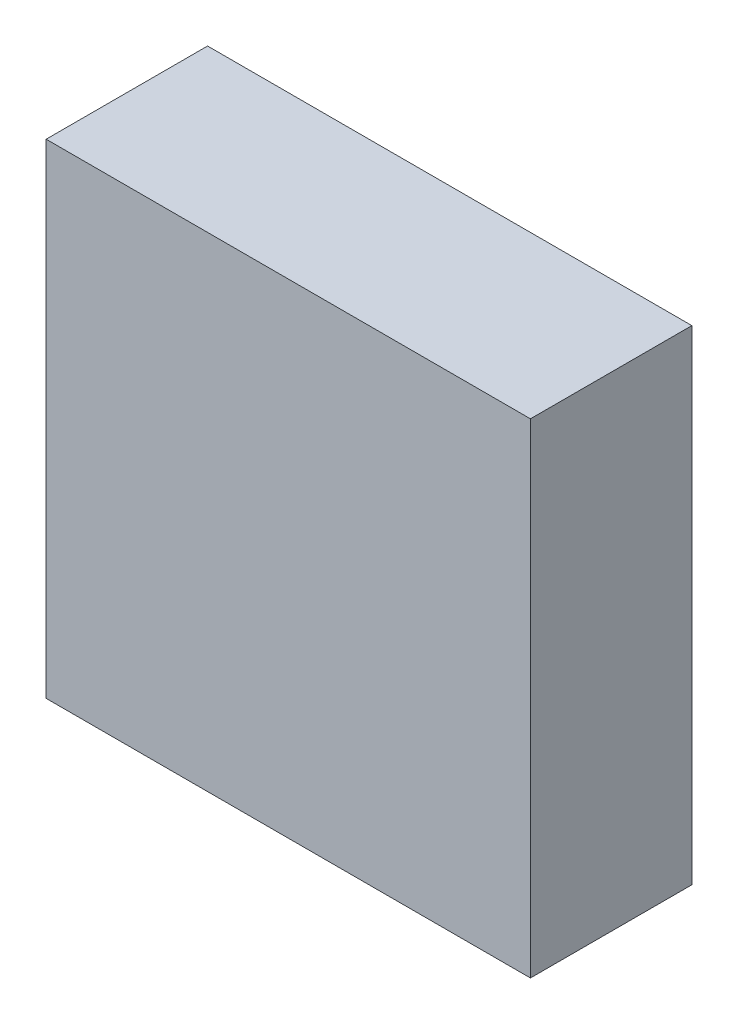
ISO-10303-21;
HEADER;
FILE_DESCRIPTION(('STEP AP214'),'2;1');
FILE_NAME('part.step','',(''),(''),'','','');
FILE_SCHEMA(('AUTOMOTIVE_DESIGN { 1 0 10303 214 1 1 1 1 }'));
ENDSEC;
DATA;
#1=APPLICATION_CONTEXT('core data for automotive mechanical design processes');
#2=APPLICATION_PROTOCOL_DEFINITION('international standard','automotive_design',2000,#1);
#3=PRODUCT_CONTEXT('',#1,'mechanical');
#4=PRODUCT('Part','Part','',(#3));
#5=PRODUCT_RELATED_PRODUCT_CATEGORY('part','',(#4));
#6=PRODUCT_DEFINITION_FORMATION('','',#4);
#7=PRODUCT_DEFINITION_CONTEXT('part definition',#1,'design');
#8=PRODUCT_DEFINITION('design','',#6,#7);
#9=PRODUCT_DEFINITION_SHAPE('','',#8);
#10=(LENGTH_UNIT() NAMED_UNIT(*) SI_UNIT(.MILLI.,.METRE.));
#11=(NAMED_UNIT(*) PLANE_ANGLE_UNIT() SI_UNIT($,.RADIAN.));
#12=(NAMED_UNIT(*) SI_UNIT($,.STERADIAN.) SOLID_ANGLE_UNIT());
#13=UNCERTAINTY_MEASURE_WITH_UNIT(LENGTH_MEASURE(1.E-05),#10,'distance_accuracy_value','');
#14=(GEOMETRIC_REPRESENTATION_CONTEXT(3) GLOBAL_UNCERTAINTY_ASSIGNED_CONTEXT((#13)) GLOBAL_UNIT_ASSIGNED_CONTEXT((#10,
#11,#12)) REPRESENTATION_CONTEXT('',''));
#15=CARTESIAN_POINT('',(0.,0.,0.));
#16=DIRECTION('',(0.,0.,1.));
#17=DIRECTION('',(1.,0.,0.));
#18=AXIS2_PLACEMENT_3D('',#15,#16,#17);
#19=CARTESIAN_POINT('',(15.,-15.,10.));
#20=DIRECTION('',(-1.,0.,0.));
#21=DIRECTION('',(0.,0.,1.));
#22=AXIS2_PLACEMENT_3D('',#19,#20,#21);
#23=PLANE('',#22);
#24=DIRECTION('',(0.,1.,0.));
#25=VECTOR('',#24,1.);
#26=CARTESIAN_POINT('',(15.,-15.,0.));
#27=LINE('',#26,#25);
#28=CARTESIAN_POINT('',(15.,-15.,0.));
#29=VERTEX_POINT('',#28);
#30=CARTESIAN_POINT('',(15.,15.,0.));
#31=VERTEX_POINT('',#30);
#32=EDGE_CURVE('E96',#29,#31,#27,.T.);
#33=ORIENTED_EDGE('',*,*,#32,.T.);
#34=DIRECTION('',(0.,0.,-1.));
#35=VECTOR('',#34,1.);
#36=CARTESIAN_POINT('',(15.,15.,10.));
#37=LINE('',#36,#35);
#38=CARTESIAN_POINT('',(15.,15.,10.));
#39=VERTEX_POINT('',#38);
#40=EDGE_CURVE('E11',#39,#31,#37,.T.);
#41=ORIENTED_EDGE('',*,*,#40,.F.);
#42=DIRECTION('',(0.,1.,0.));
#43=VECTOR('',#42,1.);
#44=CARTESIAN_POINT('',(15.,-15.,10.));
#45=LINE('',#44,#43);
#46=CARTESIAN_POINT('',(15.,-15.,10.));
#47=VERTEX_POINT('',#46);
#48=EDGE_CURVE('E84',#47,#39,#45,.T.);
#49=ORIENTED_EDGE('',*,*,#48,.F.);
#50=DIRECTION('',(0.,0.,-1.));
#51=VECTOR('',#50,1.);
#52=CARTESIAN_POINT('',(15.,-15.,10.));
#53=LINE('',#52,#51);
#54=EDGE_CURVE('E92',#47,#29,#53,.T.);
#55=ORIENTED_EDGE('',*,*,#54,.T.);
#56=EDGE_LOOP('',(#33,#41,#49,#55));
#57=FACE_BOUND('',#56,.T.);
#58=ADVANCED_FACE('F33',(#57),#23,.F.);
#59=CARTESIAN_POINT('',(-15.,15.,10.));
#60=DIRECTION('',(0.,-1.,0.));
#61=DIRECTION('',(0.,0.,-1.));
#62=AXIS2_PLACEMENT_3D('',#59,#60,#61);
#63=PLANE('',#62);
#64=DIRECTION('',(-1.,0.,0.));
#65=VECTOR('',#64,1.);
#66=CARTESIAN_POINT('',(-15.,15.,0.));
#67=LINE('',#66,#65);
#68=CARTESIAN_POINT('',(-15.,15.,0.));
#69=VERTEX_POINT('',#68);
#70=EDGE_CURVE('E88',#31,#69,#67,.T.);
#71=ORIENTED_EDGE('',*,*,#70,.T.);
#72=DIRECTION('',(0.,0.,-1.));
#73=VECTOR('',#72,1.);
#74=CARTESIAN_POINT('',(-15.,15.,10.));
#75=LINE('',#74,#73);
#76=CARTESIAN_POINT('',(-15.,15.,10.));
#77=VERTEX_POINT('',#76);
#78=EDGE_CURVE('E41',#77,#69,#75,.T.);
#79=ORIENTED_EDGE('',*,*,#78,.F.);
#80=DIRECTION('',(-1.,0.,0.));
#81=VECTOR('',#80,1.);
#82=CARTESIAN_POINT('',(-15.,15.,10.));
#83=LINE('',#82,#81);
#84=EDGE_CURVE('E79',#39,#77,#83,.T.);
#85=ORIENTED_EDGE('',*,*,#84,.F.);
#86=ORIENTED_EDGE('',*,*,#40,.T.);
#87=EDGE_LOOP('',(#71,#79,#85,#86));
#88=FACE_BOUND('',#87,.T.);
#89=ADVANCED_FACE('F87',(#88),#63,.F.);
#90=CARTESIAN_POINT('',(-15.,-15.,10.));
#91=DIRECTION('',(1.,0.,0.));
#92=DIRECTION('',(0.,0.,-1.));
#93=AXIS2_PLACEMENT_3D('',#90,#91,#92);
#94=PLANE('',#93);
#95=DIRECTION('',(0.,-1.,0.));
#96=VECTOR('',#95,1.);
#97=CARTESIAN_POINT('',(-15.,-15.,0.));
#98=LINE('',#97,#96);
#99=CARTESIAN_POINT('',(-15.,-15.,0.));
#100=VERTEX_POINT('',#99);
#101=EDGE_CURVE('E66',#69,#100,#98,.T.);
#102=ORIENTED_EDGE('',*,*,#101,.T.);
#103=DIRECTION('',(0.,0.,-1.));
#104=VECTOR('',#103,1.);
#105=CARTESIAN_POINT('',(-15.,-15.,10.));
#106=LINE('',#105,#104);
#107=CARTESIAN_POINT('',(-15.,-15.,10.));
#108=VERTEX_POINT('',#107);
#109=EDGE_CURVE('E89',#108,#100,#106,.T.);
#110=ORIENTED_EDGE('',*,*,#109,.F.);
#111=DIRECTION('',(0.,-1.,0.));
#112=VECTOR('',#111,1.);
#113=CARTESIAN_POINT('',(-15.,-15.,10.));
#114=LINE('',#113,#112);
#115=EDGE_CURVE('E82',#77,#108,#114,.T.);
#116=ORIENTED_EDGE('',*,*,#115,.F.);
#117=ORIENTED_EDGE('',*,*,#78,.T.);
#118=EDGE_LOOP('',(#102,#110,#116,#117));
#119=FACE_BOUND('',#118,.T.);
#120=ADVANCED_FACE('F90',(#119),#94,.F.);
#121=CARTESIAN_POINT('',(-15.,-15.,10.));
#122=DIRECTION('',(0.,1.,0.));
#123=DIRECTION('',(0.,0.,1.));
#124=AXIS2_PLACEMENT_3D('',#121,#122,#123);
#125=PLANE('',#124);
#126=DIRECTION('',(1.,0.,0.));
#127=VECTOR('',#126,1.);
#128=CARTESIAN_POINT('',(-15.,-15.,0.));
#129=LINE('',#128,#127);
#130=EDGE_CURVE('E72',#100,#29,#129,.T.);
#131=ORIENTED_EDGE('',*,*,#130,.T.);
#132=ORIENTED_EDGE('',*,*,#54,.F.);
#133=DIRECTION('',(1.,0.,0.));
#134=VECTOR('',#133,1.);
#135=CARTESIAN_POINT('',(-15.,-15.,10.));
#136=LINE('',#135,#134);
#137=EDGE_CURVE('E49',#108,#47,#136,.T.);
#138=ORIENTED_EDGE('',*,*,#137,.F.);
#139=ORIENTED_EDGE('',*,*,#109,.T.);
#140=EDGE_LOOP('',(#131,#132,#138,#139));
#141=FACE_BOUND('',#140,.T.);
#142=ADVANCED_FACE('F103',(#141),#125,.F.);
#143=CARTESIAN_POINT('',(0.,0.,10.));
#144=DIRECTION('',(0.,0.,-1.));
#145=DIRECTION('',(-1.,0.,0.));
#146=AXIS2_PLACEMENT_3D('',#143,#144,#145);
#147=PLANE('',#146);
#148=ORIENTED_EDGE('',*,*,#48,.T.);
#149=ORIENTED_EDGE('',*,*,#84,.T.);
#150=ORIENTED_EDGE('',*,*,#115,.T.);
#151=ORIENTED_EDGE('',*,*,#137,.T.);
#152=EDGE_LOOP('',(#148,#149,#150,#151));
#153=FACE_BOUND('',#152,.T.);
#154=ADVANCED_FACE('F80',(#153),#147,.F.);
#155=CARTESIAN_POINT('',(0.,0.,0.));
#156=DIRECTION('',(0.,0.,-1.));
#157=DIRECTION('',(-1.,0.,0.));
#158=AXIS2_PLACEMENT_3D('',#155,#156,#157);
#159=PLANE('',#158);
#160=ORIENTED_EDGE('',*,*,#32,.F.);
#161=ORIENTED_EDGE('',*,*,#130,.F.);
#162=ORIENTED_EDGE('',*,*,#101,.F.);
#163=ORIENTED_EDGE('',*,*,#70,.F.);
#164=EDGE_LOOP('',(#160,#161,#162,#163));
#165=FACE_BOUND('',#164,.T.);
#166=ADVANCED_FACE('F106',(#165),#159,.T.);
#167=CLOSED_SHELL('',(#58,#89,#120,#142,#154,#166));
#168=MANIFOLD_SOLID_BREP('B2',#167);
#169=ADVANCED_BREP_SHAPE_REPRESENTATION('',(#18,#168),#14);
#170=SHAPE_DEFINITION_REPRESENTATION(#9,#169);
ENDSEC;
END-ISO-10303-21;
